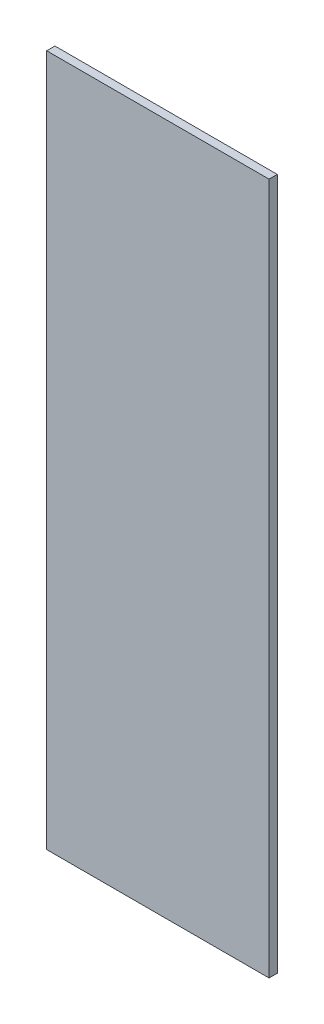
ISO-10303-21;
HEADER;
FILE_DESCRIPTION(('STEP AP214'),'2;1');
FILE_NAME('part.step','',(''),(''),'','','');
FILE_SCHEMA(('AUTOMOTIVE_DESIGN { 1 0 10303 214 1 1 1 1 }'));
ENDSEC;
DATA;
#1=APPLICATION_CONTEXT('core data for automotive mechanical design processes');
#2=APPLICATION_PROTOCOL_DEFINITION('international standard','automotive_design',2000,#1);
#3=PRODUCT_CONTEXT('',#1,'mechanical');
#4=PRODUCT('Part','Part','',(#3));
#5=PRODUCT_RELATED_PRODUCT_CATEGORY('part','',(#4));
#6=PRODUCT_DEFINITION_FORMATION('','',#4);
#7=PRODUCT_DEFINITION_CONTEXT('part definition',#1,'design');
#8=PRODUCT_DEFINITION('design','',#6,#7);
#9=PRODUCT_DEFINITION_SHAPE('','',#8);
#10=(LENGTH_UNIT() NAMED_UNIT(*) SI_UNIT(.MILLI.,.METRE.));
#11=(NAMED_UNIT(*) PLANE_ANGLE_UNIT() SI_UNIT($,.RADIAN.));
#12=(NAMED_UNIT(*) SI_UNIT($,.STERADIAN.) SOLID_ANGLE_UNIT());
#13=UNCERTAINTY_MEASURE_WITH_UNIT(LENGTH_MEASURE(1.E-05),#10,'distance_accuracy_value','');
#14=(GEOMETRIC_REPRESENTATION_CONTEXT(3) GLOBAL_UNCERTAINTY_ASSIGNED_CONTEXT((#13)) GLOBAL_UNIT_ASSIGNED_CONTEXT((#10,
#11,#12)) REPRESENTATION_CONTEXT('',''));
#15=CARTESIAN_POINT('',(0.,0.,0.));
#16=DIRECTION('',(0.,0.,1.));
#17=DIRECTION('',(1.,0.,0.));
#18=AXIS2_PLACEMENT_3D('',#15,#16,#17);
#19=CARTESIAN_POINT('',(171.45,-533.4,12.7));
#20=DIRECTION('',(-1.,0.,0.));
#21=DIRECTION('',(0.,0.,1.));
#22=AXIS2_PLACEMENT_3D('',#19,#20,#21);
#23=PLANE('',#22);
#24=DIRECTION('',(0.,1.,0.));
#25=VECTOR('',#24,1.);
#26=CARTESIAN_POINT('',(171.45,-533.4,0.));
#27=LINE('',#26,#25);
#28=CARTESIAN_POINT('',(171.45,-533.4,0.));
#29=VERTEX_POINT('',#28);
#30=CARTESIAN_POINT('',(171.45,533.4,0.));
#31=VERTEX_POINT('',#30);
#32=EDGE_CURVE('E96',#29,#31,#27,.T.);
#33=ORIENTED_EDGE('',*,*,#32,.T.);
#34=DIRECTION('',(0.,0.,-1.));
#35=VECTOR('',#34,1.);
#36=CARTESIAN_POINT('',(171.45,533.4,12.7));
#37=LINE('',#36,#35);
#38=CARTESIAN_POINT('',(171.45,533.4,12.7));
#39=VERTEX_POINT('',#38);
#40=EDGE_CURVE('E11',#39,#31,#37,.T.);
#41=ORIENTED_EDGE('',*,*,#40,.F.);
#42=DIRECTION('',(0.,1.,0.));
#43=VECTOR('',#42,1.);
#44=CARTESIAN_POINT('',(171.45,-533.4,12.7));
#45=LINE('',#44,#43);
#46=CARTESIAN_POINT('',(171.45,-533.4,12.7));
#47=VERTEX_POINT('',#46);
#48=EDGE_CURVE('E84',#47,#39,#45,.T.);
#49=ORIENTED_EDGE('',*,*,#48,.F.);
#50=DIRECTION('',(0.,0.,-1.));
#51=VECTOR('',#50,1.);
#52=CARTESIAN_POINT('',(171.45,-533.4,12.7));
#53=LINE('',#52,#51);
#54=EDGE_CURVE('E92',#47,#29,#53,.T.);
#55=ORIENTED_EDGE('',*,*,#54,.T.);
#56=EDGE_LOOP('',(#33,#41,#49,#55));
#57=FACE_BOUND('',#56,.T.);
#58=ADVANCED_FACE('F33',(#57),#23,.F.);
#59=CARTESIAN_POINT('',(-171.45,533.4,12.7));
#60=DIRECTION('',(0.,-1.,0.));
#61=DIRECTION('',(0.,0.,-1.));
#62=AXIS2_PLACEMENT_3D('',#59,#60,#61);
#63=PLANE('',#62);
#64=DIRECTION('',(-1.,0.,0.));
#65=VECTOR('',#64,1.);
#66=CARTESIAN_POINT('',(-171.45,533.4,0.));
#67=LINE('',#66,#65);
#68=CARTESIAN_POINT('',(-171.45,533.4,0.));
#69=VERTEX_POINT('',#68);
#70=EDGE_CURVE('E88',#31,#69,#67,.T.);
#71=ORIENTED_EDGE('',*,*,#70,.T.);
#72=DIRECTION('',(0.,0.,-1.));
#73=VECTOR('',#72,1.);
#74=CARTESIAN_POINT('',(-171.45,533.4,12.7));
#75=LINE('',#74,#73);
#76=CARTESIAN_POINT('',(-171.45,533.4,12.7));
#77=VERTEX_POINT('',#76);
#78=EDGE_CURVE('E41',#77,#69,#75,.T.);
#79=ORIENTED_EDGE('',*,*,#78,.F.);
#80=DIRECTION('',(-1.,0.,0.));
#81=VECTOR('',#80,1.);
#82=CARTESIAN_POINT('',(-171.45,533.4,12.7));
#83=LINE('',#82,#81);
#84=EDGE_CURVE('E79',#39,#77,#83,.T.);
#85=ORIENTED_EDGE('',*,*,#84,.F.);
#86=ORIENTED_EDGE('',*,*,#40,.T.);
#87=EDGE_LOOP('',(#71,#79,#85,#86));
#88=FACE_BOUND('',#87,.T.);
#89=ADVANCED_FACE('F87',(#88),#63,.F.);
#90=CARTESIAN_POINT('',(-171.45,-533.4,12.7));
#91=DIRECTION('',(1.,0.,0.));
#92=DIRECTION('',(0.,0.,-1.));
#93=AXIS2_PLACEMENT_3D('',#90,#91,#92);
#94=PLANE('',#93);
#95=DIRECTION('',(0.,-1.,0.));
#96=VECTOR('',#95,1.);
#97=CARTESIAN_POINT('',(-171.45,-533.4,0.));
#98=LINE('',#97,#96);
#99=CARTESIAN_POINT('',(-171.45,-533.4,0.));
#100=VERTEX_POINT('',#99);
#101=EDGE_CURVE('E66',#69,#100,#98,.T.);
#102=ORIENTED_EDGE('',*,*,#101,.T.);
#103=DIRECTION('',(0.,0.,-1.));
#104=VECTOR('',#103,1.);
#105=CARTESIAN_POINT('',(-171.45,-533.4,12.7));
#106=LINE('',#105,#104);
#107=CARTESIAN_POINT('',(-171.45,-533.4,12.7));
#108=VERTEX_POINT('',#107);
#109=EDGE_CURVE('E89',#108,#100,#106,.T.);
#110=ORIENTED_EDGE('',*,*,#109,.F.);
#111=DIRECTION('',(0.,-1.,0.));
#112=VECTOR('',#111,1.);
#113=CARTESIAN_POINT('',(-171.45,-533.4,12.7));
#114=LINE('',#113,#112);
#115=EDGE_CURVE('E82',#77,#108,#114,.T.);
#116=ORIENTED_EDGE('',*,*,#115,.F.);
#117=ORIENTED_EDGE('',*,*,#78,.T.);
#118=EDGE_LOOP('',(#102,#110,#116,#117));
#119=FACE_BOUND('',#118,.T.);
#120=ADVANCED_FACE('F90',(#119),#94,.F.);
#121=CARTESIAN_POINT('',(-171.45,-533.4,12.7));
#122=DIRECTION('',(0.,1.,0.));
#123=DIRECTION('',(0.,0.,1.));
#124=AXIS2_PLACEMENT_3D('',#121,#122,#123);
#125=PLANE('',#124);
#126=DIRECTION('',(1.,0.,0.));
#127=VECTOR('',#126,1.);
#128=CARTESIAN_POINT('',(-171.45,-533.4,0.));
#129=LINE('',#128,#127);
#130=EDGE_CURVE('E72',#100,#29,#129,.T.);
#131=ORIENTED_EDGE('',*,*,#130,.T.);
#132=ORIENTED_EDGE('',*,*,#54,.F.);
#133=DIRECTION('',(1.,0.,0.));
#134=VECTOR('',#133,1.);
#135=CARTESIAN_POINT('',(-171.45,-533.4,12.7));
#136=LINE('',#135,#134);
#137=EDGE_CURVE('E49',#108,#47,#136,.T.);
#138=ORIENTED_EDGE('',*,*,#137,.F.);
#139=ORIENTED_EDGE('',*,*,#109,.T.);
#140=EDGE_LOOP('',(#131,#132,#138,#139));
#141=FACE_BOUND('',#140,.T.);
#142=ADVANCED_FACE('F103',(#141),#125,.F.);
#143=CARTESIAN_POINT('',(0.,0.,12.7));
#144=DIRECTION('',(0.,0.,-1.));
#145=DIRECTION('',(-1.,0.,0.));
#146=AXIS2_PLACEMENT_3D('',#143,#144,#145);
#147=PLANE('',#146);
#148=ORIENTED_EDGE('',*,*,#48,.T.);
#149=ORIENTED_EDGE('',*,*,#84,.T.);
#150=ORIENTED_EDGE('',*,*,#115,.T.);
#151=ORIENTED_EDGE('',*,*,#137,.T.);
#152=EDGE_LOOP('',(#148,#149,#150,#151));
#153=FACE_BOUND('',#152,.T.);
#154=ADVANCED_FACE('F80',(#153),#147,.F.);
#155=CARTESIAN_POINT('',(0.,0.,0.));
#156=DIRECTION('',(0.,0.,-1.));
#157=DIRECTION('',(-1.,0.,0.));
#158=AXIS2_PLACEMENT_3D('',#155,#156,#157);
#159=PLANE('',#158);
#160=ORIENTED_EDGE('',*,*,#32,.F.);
#161=ORIENTED_EDGE('',*,*,#130,.F.);
#162=ORIENTED_EDGE('',*,*,#101,.F.);
#163=ORIENTED_EDGE('',*,*,#70,.F.);
#164=EDGE_LOOP('',(#160,#161,#162,#163));
#165=FACE_BOUND('',#164,.T.);
#166=ADVANCED_FACE('F106',(#165),#159,.T.);
#167=CLOSED_SHELL('',(#58,#89,#120,#142,#154,#166));
#168=MANIFOLD_SOLID_BREP('B2',#167);
#169=ADVANCED_BREP_SHAPE_REPRESENTATION('',(#18,#168),#14);
#170=SHAPE_DEFINITION_REPRESENTATION(#9,#169);
ENDSEC;
END-ISO-10303-21;
